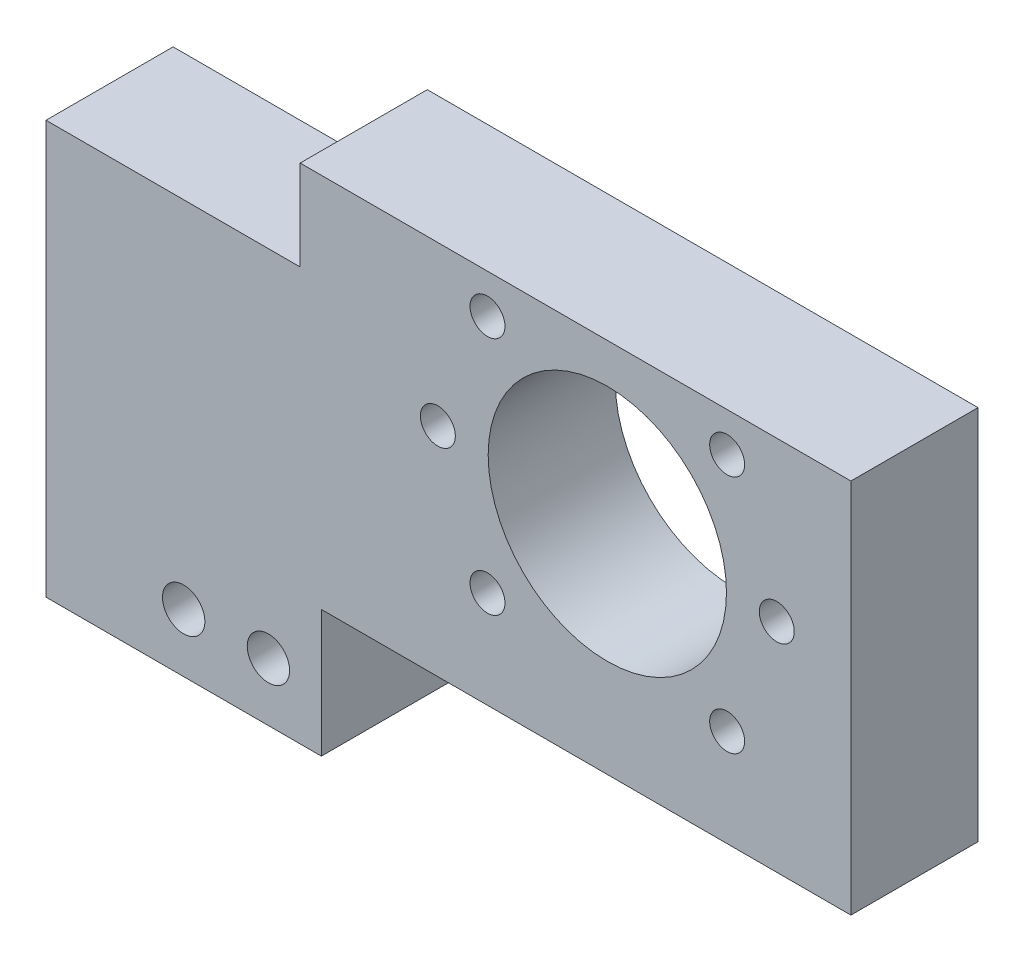
ISO-10303-21;
HEADER;
FILE_DESCRIPTION(('STEP AP214'),'2;1');
FILE_NAME('part.step','',(''),(''),'','','');
FILE_SCHEMA(('AUTOMOTIVE_DESIGN { 1 0 10303 214 1 1 1 1 }'));
ENDSEC;
DATA;
#1=APPLICATION_CONTEXT('core data for automotive mechanical design processes');
#2=APPLICATION_PROTOCOL_DEFINITION('international standard','automotive_design',2000,#1);
#3=PRODUCT_CONTEXT('',#1,'mechanical');
#4=PRODUCT('Part','Part','',(#3));
#5=PRODUCT_RELATED_PRODUCT_CATEGORY('part','',(#4));
#6=PRODUCT_DEFINITION_FORMATION('','',#4);
#7=PRODUCT_DEFINITION_CONTEXT('part definition',#1,'design');
#8=PRODUCT_DEFINITION('design','',#6,#7);
#9=PRODUCT_DEFINITION_SHAPE('','',#8);
#10=(LENGTH_UNIT() NAMED_UNIT(*) SI_UNIT(.MILLI.,.METRE.));
#11=(NAMED_UNIT(*) PLANE_ANGLE_UNIT() SI_UNIT($,.RADIAN.));
#12=(NAMED_UNIT(*) SI_UNIT($,.STERADIAN.) SOLID_ANGLE_UNIT());
#13=UNCERTAINTY_MEASURE_WITH_UNIT(LENGTH_MEASURE(1.E-05),#10,'distance_accuracy_value','');
#14=(GEOMETRIC_REPRESENTATION_CONTEXT(3) GLOBAL_UNCERTAINTY_ASSIGNED_CONTEXT((#13)) GLOBAL_UNIT_ASSIGNED_CONTEXT((#10,
#11,#12)) REPRESENTATION_CONTEXT('',''));
#15=CARTESIAN_POINT('',(0.,0.,0.));
#16=DIRECTION('',(0.,0.,1.));
#17=DIRECTION('',(1.,0.,0.));
#18=AXIS2_PLACEMENT_3D('',#15,#16,#17);
#19=CARTESIAN_POINT('',(-25.,-27.,27.));
#20=DIRECTION('',(0.,0.,-1.));
#21=DIRECTION('',(-1.,0.,0.));
#22=AXIS2_PLACEMENT_3D('',#19,#20,#21);
#23=CYLINDRICAL_SURFACE('',#22,2.);
#24=CARTESIAN_POINT('',(-25.,-27.,0.));
#25=DIRECTION('',(0.,0.,1.));
#26=DIRECTION('',(1.,0.,0.));
#27=AXIS2_PLACEMENT_3D('',#24,#25,#26);
#28=CIRCLE('',#27,2.);
#29=CARTESIAN_POINT('',(-23.,-27.,0.));
#30=VERTEX_POINT('',#29);
#31=EDGE_CURVE('E388',#30,#30,#28,.F.);
#32=ORIENTED_EDGE('',*,*,#31,.T.);
#33=EDGE_LOOP('',(#32));
#34=FACE_BOUND('',#33,.T.);
#35=CARTESIAN_POINT('',(-25.,-27.,12.));
#36=DIRECTION('',(0.,0.,-1.));
#37=DIRECTION('',(-1.,0.,0.));
#38=AXIS2_PLACEMENT_3D('',#35,#36,#37);
#39=CIRCLE('',#38,2.);
#40=CARTESIAN_POINT('',(-27.,-27.,12.));
#41=VERTEX_POINT('',#40);
#42=EDGE_CURVE('E223',#41,#41,#39,.T.);
#43=ORIENTED_EDGE('',*,*,#42,.F.);
#44=EDGE_LOOP('',(#43));
#45=FACE_BOUND('',#44,.T.);
#46=ADVANCED_FACE('F43',(#34,#45),#23,.F.);
#47=CARTESIAN_POINT('',(-17.,-27.,27.));
#48=DIRECTION('',(0.,0.,-1.));
#49=DIRECTION('',(-1.,0.,0.));
#50=AXIS2_PLACEMENT_3D('',#47,#48,#49);
#51=CYLINDRICAL_SURFACE('',#50,2.);
#52=CARTESIAN_POINT('',(-17.,-27.,0.));
#53=DIRECTION('',(0.,0.,1.));
#54=DIRECTION('',(1.,0.,0.));
#55=AXIS2_PLACEMENT_3D('',#52,#53,#54);
#56=CIRCLE('',#55,2.);
#57=CARTESIAN_POINT('',(-15.,-27.,0.));
#58=VERTEX_POINT('',#57);
#59=EDGE_CURVE('E384',#58,#58,#56,.F.);
#60=ORIENTED_EDGE('',*,*,#59,.T.);
#61=EDGE_LOOP('',(#60));
#62=FACE_BOUND('',#61,.T.);
#63=CARTESIAN_POINT('',(-17.,-27.,12.));
#64=DIRECTION('',(0.,0.,-1.));
#65=DIRECTION('',(-1.,0.,0.));
#66=AXIS2_PLACEMENT_3D('',#63,#64,#65);
#67=CIRCLE('',#66,2.);
#68=CARTESIAN_POINT('',(-19.,-27.,12.));
#69=VERTEX_POINT('',#68);
#70=EDGE_CURVE('E227',#69,#69,#67,.T.);
#71=ORIENTED_EDGE('',*,*,#70,.F.);
#72=EDGE_LOOP('',(#71));
#73=FACE_BOUND('',#72,.T.);
#74=ADVANCED_FACE('F423',(#62,#73),#51,.F.);
#75=CARTESIAN_POINT('',(0.,-20.5,0.));
#76=DIRECTION('',(0.,1.,0.));
#77=DIRECTION('',(0.,0.,1.));
#78=AXIS2_PLACEMENT_3D('',#75,#76,#77);
#79=PLANE('',#78);
#80=DIRECTION('',(0.,0.,1.));
#81=VECTOR('',#80,1.);
#82=CARTESIAN_POINT('',(38.,-20.5,0.));
#83=LINE('',#82,#81);
#84=CARTESIAN_POINT('',(38.,-20.5,0.));
#85=VERTEX_POINT('',#84);
#86=CARTESIAN_POINT('',(38.,-20.5,12.));
#87=VERTEX_POINT('',#86);
#88=EDGE_CURVE('E165',#85,#87,#83,.T.);
#89=ORIENTED_EDGE('',*,*,#88,.T.);
#90=DIRECTION('',(-1.,0.,0.));
#91=VECTOR('',#90,1.);
#92=CARTESIAN_POINT('',(38.,-20.5,12.));
#93=LINE('',#92,#91);
#94=CARTESIAN_POINT('',(-12.,-20.5,12.));
#95=VERTEX_POINT('',#94);
#96=EDGE_CURVE('E144',#87,#95,#93,.T.);
#97=ORIENTED_EDGE('',*,*,#96,.T.);
#98=DIRECTION('',(0.,0.,1.));
#99=VECTOR('',#98,1.);
#100=CARTESIAN_POINT('',(-12.,-20.5,12.));
#101=LINE('',#100,#99);
#102=CARTESIAN_POINT('',(-12.,-20.5,0.));
#103=VERTEX_POINT('',#102);
#104=EDGE_CURVE('E232',#103,#95,#101,.T.);
#105=ORIENTED_EDGE('',*,*,#104,.F.);
#106=DIRECTION('',(1.,0.,0.));
#107=VECTOR('',#106,1.);
#108=CARTESIAN_POINT('',(0.,-20.5,0.));
#109=LINE('',#108,#107);
#110=EDGE_CURVE('E172',#103,#85,#109,.T.);
#111=ORIENTED_EDGE('',*,*,#110,.T.);
#112=EDGE_LOOP('',(#89,#97,#105,#111));
#113=FACE_BOUND('',#112,.T.);
#114=ADVANCED_FACE('F171',(#113),#79,.F.);
#115=CARTESIAN_POINT('',(15.,0.,27.));
#116=DIRECTION('',(0.,0.,-1.));
#117=DIRECTION('',(-1.,0.,0.));
#118=AXIS2_PLACEMENT_3D('',#115,#116,#117);
#119=CYLINDRICAL_SURFACE('',#118,11.25);
#120=CARTESIAN_POINT('',(15.,0.,12.));
#121=DIRECTION('',(0.,0.,-1.));
#122=DIRECTION('',(-1.,0.,0.));
#123=AXIS2_PLACEMENT_3D('',#120,#121,#122);
#124=CIRCLE('',#123,11.25);
#125=CARTESIAN_POINT('',(3.75,0.,12.));
#126=VERTEX_POINT('',#125);
#127=EDGE_CURVE('E318',#126,#126,#124,.F.);
#128=ORIENTED_EDGE('',*,*,#127,.T.);
#129=EDGE_LOOP('',(#128));
#130=FACE_BOUND('',#129,.T.);
#131=CARTESIAN_POINT('',(15.,0.,0.));
#132=DIRECTION('',(0.,0.,-1.));
#133=DIRECTION('',(-1.,0.,0.));
#134=AXIS2_PLACEMENT_3D('',#131,#132,#133);
#135=CIRCLE('',#134,11.25);
#136=CARTESIAN_POINT('',(3.75,0.,0.));
#137=VERTEX_POINT('',#136);
#138=EDGE_CURVE('E219',#137,#137,#135,.F.);
#139=ORIENTED_EDGE('',*,*,#138,.F.);
#140=EDGE_LOOP('',(#139));
#141=FACE_BOUND('',#140,.T.);
#142=ADVANCED_FACE('F486',(#130,#141),#119,.F.);
#143=CARTESIAN_POINT('',(-35.,6.5,0.));
#144=DIRECTION('',(0.,-1.,0.));
#145=DIRECTION('',(0.,0.,-1.));
#146=AXIS2_PLACEMENT_3D('',#143,#144,#145);
#147=PLANE('',#146);
#148=DIRECTION('',(0.,0.,-1.));
#149=VECTOR('',#148,1.);
#150=CARTESIAN_POINT('',(-38.,6.5,27.));
#151=LINE('',#150,#149);
#152=CARTESIAN_POINT('',(-38.,6.5,12.));
#153=VERTEX_POINT('',#152);
#154=CARTESIAN_POINT('',(-38.,6.5,0.));
#155=VERTEX_POINT('',#154);
#156=EDGE_CURVE('E178',#153,#155,#151,.T.);
#157=ORIENTED_EDGE('',*,*,#156,.F.);
#158=DIRECTION('',(1.,0.,0.));
#159=VECTOR('',#158,1.);
#160=CARTESIAN_POINT('',(-35.,6.5,12.));
#161=LINE('',#160,#159);
#162=CARTESIAN_POINT('',(-14.,6.5,12.));
#163=VERTEX_POINT('',#162);
#164=EDGE_CURVE('E326',#153,#163,#161,.T.);
#165=ORIENTED_EDGE('',*,*,#164,.T.);
#166=DIRECTION('',(0.,0.,1.));
#167=VECTOR('',#166,1.);
#168=CARTESIAN_POINT('',(-14.,6.5,0.));
#169=LINE('',#168,#167);
#170=CARTESIAN_POINT('',(-14.,6.5,0.));
#171=VERTEX_POINT('',#170);
#172=EDGE_CURVE('E186',#171,#163,#169,.T.);
#173=ORIENTED_EDGE('',*,*,#172,.F.);
#174=DIRECTION('',(-1.,0.,0.));
#175=VECTOR('',#174,1.);
#176=CARTESIAN_POINT('',(-35.,6.5,0.));
#177=LINE('',#176,#175);
#178=EDGE_CURVE('E380',#171,#155,#177,.T.);
#179=ORIENTED_EDGE('',*,*,#178,.T.);
#180=EDGE_LOOP('',(#157,#165,#173,#179));
#181=FACE_BOUND('',#180,.T.);
#182=ADVANCED_FACE('F459',(#181),#147,.F.);
#183=CARTESIAN_POINT('',(-35.,15.,27.));
#184=DIRECTION('',(0.,-1.,0.));
#185=DIRECTION('',(0.,0.,-1.));
#186=AXIS2_PLACEMENT_3D('',#183,#184,#185);
#187=PLANE('',#186);
#188=DIRECTION('',(0.,0.,1.));
#189=VECTOR('',#188,1.);
#190=CARTESIAN_POINT('',(-14.,15.,0.));
#191=LINE('',#190,#189);
#192=CARTESIAN_POINT('',(-14.,15.,0.));
#193=VERTEX_POINT('',#192);
#194=CARTESIAN_POINT('',(-14.,15.,12.));
#195=VERTEX_POINT('',#194);
#196=EDGE_CURVE('E187',#193,#195,#191,.T.);
#197=ORIENTED_EDGE('',*,*,#196,.T.);
#198=DIRECTION('',(-1.,0.,0.));
#199=VECTOR('',#198,1.);
#200=CARTESIAN_POINT('',(38.,15.,12.));
#201=LINE('',#200,#199);
#202=CARTESIAN_POINT('',(38.,15.,12.));
#203=VERTEX_POINT('',#202);
#204=EDGE_CURVE('E158',#203,#195,#201,.T.);
#205=ORIENTED_EDGE('',*,*,#204,.F.);
#206=DIRECTION('',(0.,0.,1.));
#207=VECTOR('',#206,1.);
#208=CARTESIAN_POINT('',(38.,15.,0.));
#209=LINE('',#208,#207);
#210=CARTESIAN_POINT('',(38.,15.,0.));
#211=VERTEX_POINT('',#210);
#212=EDGE_CURVE('E167',#211,#203,#209,.T.);
#213=ORIENTED_EDGE('',*,*,#212,.F.);
#214=DIRECTION('',(1.,0.,0.));
#215=VECTOR('',#214,1.);
#216=CARTESIAN_POINT('',(-35.,15.,0.));
#217=LINE('',#216,#215);
#218=EDGE_CURVE('E218',#193,#211,#217,.T.);
#219=ORIENTED_EDGE('',*,*,#218,.F.);
#220=EDGE_LOOP('',(#197,#205,#213,#219));
#221=FACE_BOUND('',#220,.T.);
#222=ADVANCED_FACE('F320',(#221),#187,.F.);
#223=CARTESIAN_POINT('',(26.3137084989847,11.3137084989848,0.));
#224=DIRECTION('',(0.,0.,1.));
#225=DIRECTION('',(1.,0.,0.));
#226=AXIS2_PLACEMENT_3D('',#223,#224,#225);
#227=CYLINDRICAL_SURFACE('',#226,1.65);
#228=CARTESIAN_POINT('',(26.3137084989847,11.3137084989848,12.));
#229=DIRECTION('',(0.,0.,-1.));
#230=DIRECTION('',(-1.,0.,0.));
#231=AXIS2_PLACEMENT_3D('',#228,#229,#230);
#232=CIRCLE('',#231,1.65);
#233=CARTESIAN_POINT('',(24.6637084989847,11.3137084989848,12.));
#234=VERTEX_POINT('',#233);
#235=EDGE_CURVE('E352',#234,#234,#232,.F.);
#236=ORIENTED_EDGE('',*,*,#235,.T.);
#237=EDGE_LOOP('',(#236));
#238=FACE_BOUND('',#237,.T.);
#239=CARTESIAN_POINT('',(26.3137084989847,11.3137084989848,0.));
#240=DIRECTION('',(0.,0.,1.));
#241=DIRECTION('',(1.,0.,0.));
#242=AXIS2_PLACEMENT_3D('',#239,#240,#241);
#243=CIRCLE('',#242,1.65);
#244=CARTESIAN_POINT('',(27.9637084989847,11.3137084989848,0.));
#245=VERTEX_POINT('',#244);
#246=EDGE_CURVE('E204',#245,#245,#243,.T.);
#247=ORIENTED_EDGE('',*,*,#246,.F.);
#248=EDGE_LOOP('',(#247));
#249=FACE_BOUND('',#248,.T.);
#250=ADVANCED_FACE('F458',(#238,#249),#227,.F.);
#251=CARTESIAN_POINT('',(31.,0.,0.));
#252=DIRECTION('',(0.,0.,1.));
#253=DIRECTION('',(1.,0.,0.));
#254=AXIS2_PLACEMENT_3D('',#251,#252,#253);
#255=CYLINDRICAL_SURFACE('',#254,1.65);
#256=CARTESIAN_POINT('',(31.,0.,12.));
#257=DIRECTION('',(0.,0.,-1.));
#258=DIRECTION('',(-1.,0.,0.));
#259=AXIS2_PLACEMENT_3D('',#256,#257,#258);
#260=CIRCLE('',#259,1.65);
#261=CARTESIAN_POINT('',(29.35,0.,12.));
#262=VERTEX_POINT('',#261);
#263=EDGE_CURVE('E348',#262,#262,#260,.F.);
#264=ORIENTED_EDGE('',*,*,#263,.T.);
#265=EDGE_LOOP('',(#264));
#266=FACE_BOUND('',#265,.T.);
#267=CARTESIAN_POINT('',(31.,0.,0.));
#268=DIRECTION('',(0.,0.,1.));
#269=DIRECTION('',(1.,0.,0.));
#270=AXIS2_PLACEMENT_3D('',#267,#268,#269);
#271=CIRCLE('',#270,1.65);
#272=CARTESIAN_POINT('',(32.65,0.,0.));
#273=VERTEX_POINT('',#272);
#274=EDGE_CURVE('E200',#273,#273,#271,.T.);
#275=ORIENTED_EDGE('',*,*,#274,.F.);
#276=EDGE_LOOP('',(#275));
#277=FACE_BOUND('',#276,.T.);
#278=ADVANCED_FACE('F462',(#266,#277),#255,.F.);
#279=CARTESIAN_POINT('',(3.68629150101527,-11.3137084989848,0.));
#280=DIRECTION('',(0.,0.,1.));
#281=DIRECTION('',(1.,0.,0.));
#282=AXIS2_PLACEMENT_3D('',#279,#280,#281);
#283=CYLINDRICAL_SURFACE('',#282,1.65);
#284=CARTESIAN_POINT('',(3.68629150101527,-11.3137084989848,12.));
#285=DIRECTION('',(0.,0.,-1.));
#286=DIRECTION('',(-1.,0.,0.));
#287=AXIS2_PLACEMENT_3D('',#284,#285,#286);
#288=CIRCLE('',#287,1.65);
#289=CARTESIAN_POINT('',(2.03629150101526,-11.3137084989848,12.));
#290=VERTEX_POINT('',#289);
#291=EDGE_CURVE('E344',#290,#290,#288,.F.);
#292=ORIENTED_EDGE('',*,*,#291,.T.);
#293=EDGE_LOOP('',(#292));
#294=FACE_BOUND('',#293,.T.);
#295=CARTESIAN_POINT('',(3.68629150101527,-11.3137084989848,0.));
#296=DIRECTION('',(0.,0.,1.));
#297=DIRECTION('',(1.,0.,0.));
#298=AXIS2_PLACEMENT_3D('',#295,#296,#297);
#299=CIRCLE('',#298,1.65);
#300=CARTESIAN_POINT('',(5.33629150101527,-11.3137084989848,0.));
#301=VERTEX_POINT('',#300);
#302=EDGE_CURVE('E195',#301,#301,#299,.T.);
#303=ORIENTED_EDGE('',*,*,#302,.F.);
#304=EDGE_LOOP('',(#303));
#305=FACE_BOUND('',#304,.T.);
#306=ADVANCED_FACE('F473',(#294,#305),#283,.F.);
#307=CARTESIAN_POINT('',(3.68629150101526,11.3137084989848,0.));
#308=DIRECTION('',(0.,0.,1.));
#309=DIRECTION('',(1.,0.,0.));
#310=AXIS2_PLACEMENT_3D('',#307,#308,#309);
#311=CYLINDRICAL_SURFACE('',#310,1.65);
#312=CARTESIAN_POINT('',(3.68629150101526,11.3137084989848,12.));
#313=DIRECTION('',(0.,0.,-1.));
#314=DIRECTION('',(-1.,0.,0.));
#315=AXIS2_PLACEMENT_3D('',#312,#313,#314);
#316=CIRCLE('',#315,1.65);
#317=CARTESIAN_POINT('',(2.03629150101526,11.3137084989848,12.));
#318=VERTEX_POINT('',#317);
#319=EDGE_CURVE('E340',#318,#318,#316,.F.);
#320=ORIENTED_EDGE('',*,*,#319,.T.);
#321=EDGE_LOOP('',(#320));
#322=FACE_BOUND('',#321,.T.);
#323=CARTESIAN_POINT('',(3.68629150101526,11.3137084989848,0.));
#324=DIRECTION('',(0.,0.,1.));
#325=DIRECTION('',(-1.,0.,0.));
#326=AXIS2_PLACEMENT_3D('',#323,#324,#325);
#327=CIRCLE('',#326,1.65);
#328=CARTESIAN_POINT('',(2.03629150101526,11.3137084989848,0.));
#329=VERTEX_POINT('',#328);
#330=EDGE_CURVE('E199',#329,#329,#327,.T.);
#331=ORIENTED_EDGE('',*,*,#330,.F.);
#332=EDGE_LOOP('',(#331));
#333=FACE_BOUND('',#332,.T.);
#334=ADVANCED_FACE('F470',(#322,#333),#311,.F.);
#335=CARTESIAN_POINT('',(26.3137084989847,-11.3137084989848,0.));
#336=DIRECTION('',(0.,0.,1.));
#337=DIRECTION('',(1.,0.,0.));
#338=AXIS2_PLACEMENT_3D('',#335,#336,#337);
#339=CYLINDRICAL_SURFACE('',#338,1.65);
#340=CARTESIAN_POINT('',(26.3137084989847,-11.3137084989848,12.));
#341=DIRECTION('',(0.,0.,-1.));
#342=DIRECTION('',(-1.,0.,0.));
#343=AXIS2_PLACEMENT_3D('',#340,#341,#342);
#344=CIRCLE('',#343,1.65);
#345=CARTESIAN_POINT('',(24.6637084989847,-11.3137084989848,12.));
#346=VERTEX_POINT('',#345);
#347=EDGE_CURVE('E336',#346,#346,#344,.F.);
#348=ORIENTED_EDGE('',*,*,#347,.T.);
#349=EDGE_LOOP('',(#348));
#350=FACE_BOUND('',#349,.T.);
#351=CARTESIAN_POINT('',(26.3137084989847,-11.3137084989848,0.));
#352=DIRECTION('',(0.,0.,1.));
#353=DIRECTION('',(-1.,0.,0.));
#354=AXIS2_PLACEMENT_3D('',#351,#352,#353);
#355=CIRCLE('',#354,1.65);
#356=CARTESIAN_POINT('',(24.6637084989847,-11.3137084989848,0.));
#357=VERTEX_POINT('',#356);
#358=EDGE_CURVE('E205',#357,#357,#355,.T.);
#359=ORIENTED_EDGE('',*,*,#358,.F.);
#360=EDGE_LOOP('',(#359));
#361=FACE_BOUND('',#360,.T.);
#362=ADVANCED_FACE('F468',(#350,#361),#339,.F.);
#363=CARTESIAN_POINT('',(-0.999999999999997,0.,0.));
#364=DIRECTION('',(0.,0.,1.));
#365=DIRECTION('',(1.,0.,0.));
#366=AXIS2_PLACEMENT_3D('',#363,#364,#365);
#367=CYLINDRICAL_SURFACE('',#366,1.65);
#368=CARTESIAN_POINT('',(-0.999999999999997,0.,12.));
#369=DIRECTION('',(0.,0.,-1.));
#370=DIRECTION('',(-1.,0.,0.));
#371=AXIS2_PLACEMENT_3D('',#368,#369,#370);
#372=CIRCLE('',#371,1.65);
#373=CARTESIAN_POINT('',(-2.65,0.,12.));
#374=VERTEX_POINT('',#373);
#375=EDGE_CURVE('E332',#374,#374,#372,.F.);
#376=ORIENTED_EDGE('',*,*,#375,.T.);
#377=EDGE_LOOP('',(#376));
#378=FACE_BOUND('',#377,.T.);
#379=CARTESIAN_POINT('',(-0.999999999999997,0.,0.));
#380=DIRECTION('',(0.,0.,1.));
#381=DIRECTION('',(1.,0.,0.));
#382=AXIS2_PLACEMENT_3D('',#379,#380,#381);
#383=CIRCLE('',#382,1.65);
#384=CARTESIAN_POINT('',(0.650000000000003,0.,0.));
#385=VERTEX_POINT('',#384);
#386=EDGE_CURVE('E180',#385,#385,#383,.T.);
#387=ORIENTED_EDGE('',*,*,#386,.F.);
#388=EDGE_LOOP('',(#387));
#389=FACE_BOUND('',#388,.T.);
#390=ADVANCED_FACE('F464',(#378,#389),#367,.F.);
#391=CARTESIAN_POINT('',(-14.,15.,0.));
#392=DIRECTION('',(1.,0.,0.));
#393=DIRECTION('',(0.,0.,-1.));
#394=AXIS2_PLACEMENT_3D('',#391,#392,#393);
#395=PLANE('',#394);
#396=ORIENTED_EDGE('',*,*,#172,.T.);
#397=DIRECTION('',(0.,1.,0.));
#398=VECTOR('',#397,1.);
#399=CARTESIAN_POINT('',(-14.,15.,12.));
#400=LINE('',#399,#398);
#401=EDGE_CURVE('E323',#163,#195,#400,.T.);
#402=ORIENTED_EDGE('',*,*,#401,.T.);
#403=ORIENTED_EDGE('',*,*,#196,.F.);
#404=DIRECTION('',(0.,-1.,0.));
#405=VECTOR('',#404,1.);
#406=CARTESIAN_POINT('',(-14.,15.,0.));
#407=LINE('',#406,#405);
#408=EDGE_CURVE('E313',#193,#171,#407,.T.);
#409=ORIENTED_EDGE('',*,*,#408,.T.);
#410=EDGE_LOOP('',(#396,#402,#403,#409));
#411=FACE_BOUND('',#410,.T.);
#412=ADVANCED_FACE('F467',(#411),#395,.F.);
#413=CARTESIAN_POINT('',(-38.,0.,0.));
#414=DIRECTION('',(-1.,0.,0.));
#415=DIRECTION('',(0.,0.,1.));
#416=AXIS2_PLACEMENT_3D('',#413,#414,#415);
#417=PLANE('',#416);
#418=DIRECTION('',(0.,-1.,0.));
#419=VECTOR('',#418,1.);
#420=CARTESIAN_POINT('',(-38.,-12.5,12.));
#421=LINE('',#420,#419);
#422=CARTESIAN_POINT('',(-38.,-32.5,12.));
#423=VERTEX_POINT('',#422);
#424=EDGE_CURVE('E174',#153,#423,#421,.T.);
#425=ORIENTED_EDGE('',*,*,#424,.F.);
#426=ORIENTED_EDGE('',*,*,#156,.T.);
#427=DIRECTION('',(0.,-1.,0.));
#428=VECTOR('',#427,1.);
#429=CARTESIAN_POINT('',(-38.,-32.5,0.));
#430=LINE('',#429,#428);
#431=CARTESIAN_POINT('',(-38.,-32.5,0.));
#432=VERTEX_POINT('',#431);
#433=EDGE_CURVE('E317',#155,#432,#430,.T.);
#434=ORIENTED_EDGE('',*,*,#433,.T.);
#435=DIRECTION('',(0.,0.,-1.));
#436=VECTOR('',#435,1.);
#437=CARTESIAN_POINT('',(-38.,-32.5,12.));
#438=LINE('',#437,#436);
#439=EDGE_CURVE('E392',#423,#432,#438,.T.);
#440=ORIENTED_EDGE('',*,*,#439,.F.);
#441=EDGE_LOOP('',(#425,#426,#434,#440));
#442=FACE_BOUND('',#441,.T.);
#443=ADVANCED_FACE('F490',(#442),#417,.T.);
#444=CARTESIAN_POINT('',(38.,0.,0.));
#445=DIRECTION('',(1.,0.,0.));
#446=DIRECTION('',(0.,0.,-1.));
#447=AXIS2_PLACEMENT_3D('',#444,#445,#446);
#448=PLANE('',#447);
#449=DIRECTION('',(0.,-1.,0.));
#450=VECTOR('',#449,1.);
#451=CARTESIAN_POINT('',(38.,-20.5,12.));
#452=LINE('',#451,#450);
#453=EDGE_CURVE('E148',#203,#87,#452,.T.);
#454=ORIENTED_EDGE('',*,*,#453,.T.);
#455=ORIENTED_EDGE('',*,*,#88,.F.);
#456=DIRECTION('',(0.,-1.,0.));
#457=VECTOR('',#456,1.);
#458=CARTESIAN_POINT('',(38.,-32.5,0.));
#459=LINE('',#458,#457);
#460=EDGE_CURVE('E311',#211,#85,#459,.T.);
#461=ORIENTED_EDGE('',*,*,#460,.F.);
#462=ORIENTED_EDGE('',*,*,#212,.T.);
#463=EDGE_LOOP('',(#454,#455,#461,#462));
#464=FACE_BOUND('',#463,.T.);
#465=ADVANCED_FACE('F163',(#464),#448,.T.);
#466=CARTESIAN_POINT('',(-38.,-12.5,12.));
#467=DIRECTION('',(0.,0.,-1.));
#468=DIRECTION('',(-1.,0.,0.));
#469=AXIS2_PLACEMENT_3D('',#466,#467,#468);
#470=PLANE('',#469);
#471=ORIENTED_EDGE('',*,*,#70,.T.);
#472=EDGE_LOOP('',(#471));
#473=FACE_BOUND('',#472,.T.);
#474=ORIENTED_EDGE('',*,*,#42,.T.);
#475=EDGE_LOOP('',(#474));
#476=FACE_BOUND('',#475,.T.);
#477=DIRECTION('',(0.,1.,0.));
#478=VECTOR('',#477,1.);
#479=CARTESIAN_POINT('',(-12.,-37.5,12.));
#480=LINE('',#479,#478);
#481=CARTESIAN_POINT('',(-12.,-32.5,12.));
#482=VERTEX_POINT('',#481);
#483=EDGE_CURVE('E152',#482,#95,#480,.T.);
#484=ORIENTED_EDGE('',*,*,#483,.T.);
#485=ORIENTED_EDGE('',*,*,#96,.F.);
#486=ORIENTED_EDGE('',*,*,#453,.F.);
#487=ORIENTED_EDGE('',*,*,#204,.T.);
#488=ORIENTED_EDGE('',*,*,#401,.F.);
#489=ORIENTED_EDGE('',*,*,#164,.F.);
#490=ORIENTED_EDGE('',*,*,#424,.T.);
#491=DIRECTION('',(-1.,0.,0.));
#492=VECTOR('',#491,1.);
#493=CARTESIAN_POINT('',(38.,-32.5,12.));
#494=LINE('',#493,#492);
#495=EDGE_CURVE('E395',#482,#423,#494,.T.);
#496=ORIENTED_EDGE('',*,*,#495,.F.);
#497=EDGE_LOOP('',(#484,#485,#486,#487,#488,#489,#490,#496));
#498=FACE_BOUND('',#497,.T.);
#499=ORIENTED_EDGE('',*,*,#235,.F.);
#500=EDGE_LOOP('',(#499));
#501=FACE_BOUND('',#500,.T.);
#502=ORIENTED_EDGE('',*,*,#291,.F.);
#503=EDGE_LOOP('',(#502));
#504=FACE_BOUND('',#503,.T.);
#505=ORIENTED_EDGE('',*,*,#347,.F.);
#506=EDGE_LOOP('',(#505));
#507=FACE_BOUND('',#506,.T.);
#508=ORIENTED_EDGE('',*,*,#375,.F.);
#509=EDGE_LOOP('',(#508));
#510=FACE_BOUND('',#509,.T.);
#511=ORIENTED_EDGE('',*,*,#319,.F.);
#512=EDGE_LOOP('',(#511));
#513=FACE_BOUND('',#512,.T.);
#514=ORIENTED_EDGE('',*,*,#263,.F.);
#515=EDGE_LOOP('',(#514));
#516=FACE_BOUND('',#515,.T.);
#517=ORIENTED_EDGE('',*,*,#127,.F.);
#518=EDGE_LOOP('',(#517));
#519=FACE_BOUND('',#518,.T.);
#520=ADVANCED_FACE('F146',(#473,#476,#498,#501,#504,#507,#510,#513,#516,#519),#470,.F.);
#521=CARTESIAN_POINT('',(15.,0.,0.));
#522=DIRECTION('',(0.,0.,-1.));
#523=DIRECTION('',(-1.,0.,0.));
#524=AXIS2_PLACEMENT_3D('',#521,#522,#523);
#525=PLANE('',#524);
#526=ORIENTED_EDGE('',*,*,#408,.F.);
#527=ORIENTED_EDGE('',*,*,#218,.T.);
#528=ORIENTED_EDGE('',*,*,#460,.T.);
#529=ORIENTED_EDGE('',*,*,#110,.F.);
#530=DIRECTION('',(0.,1.,0.));
#531=VECTOR('',#530,1.);
#532=CARTESIAN_POINT('',(-12.,-37.5,0.));
#533=LINE('',#532,#531);
#534=CARTESIAN_POINT('',(-12.,-32.5,0.));
#535=VERTEX_POINT('',#534);
#536=EDGE_CURVE('E59',#535,#103,#533,.T.);
#537=ORIENTED_EDGE('',*,*,#536,.F.);
#538=DIRECTION('',(1.,0.,0.));
#539=VECTOR('',#538,1.);
#540=CARTESIAN_POINT('',(38.,-32.5,0.));
#541=LINE('',#540,#539);
#542=CARTESIAN_POINT('',(-30.,-32.5,0.));
#543=VERTEX_POINT('',#542);
#544=EDGE_CURVE('E11',#543,#535,#541,.T.);
#545=ORIENTED_EDGE('',*,*,#544,.F.);
#546=DIRECTION('',(0.,-1.,0.));
#547=VECTOR('',#546,1.);
#548=CARTESIAN_POINT('',(-30.,-21.5,0.));
#549=LINE('',#548,#547);
#550=CARTESIAN_POINT('',(-30.,-21.5,0.));
#551=VERTEX_POINT('',#550);
#552=EDGE_CURVE('E365',#551,#543,#549,.T.);
#553=ORIENTED_EDGE('',*,*,#552,.F.);
#554=DIRECTION('',(-1.,0.,0.));
#555=VECTOR('',#554,1.);
#556=CARTESIAN_POINT('',(-31.,-21.5,0.));
#557=LINE('',#556,#555);
#558=CARTESIAN_POINT('',(-32.,-21.5,0.));
#559=VERTEX_POINT('',#558);
#560=EDGE_CURVE('E369',#551,#559,#557,.T.);
#561=ORIENTED_EDGE('',*,*,#560,.T.);
#562=DIRECTION('',(0.,1.,0.));
#563=VECTOR('',#562,1.);
#564=CARTESIAN_POINT('',(-32.,-21.5,0.));
#565=LINE('',#564,#563);
#566=CARTESIAN_POINT('',(-32.,-32.5,0.));
#567=VERTEX_POINT('',#566);
#568=EDGE_CURVE('E281',#567,#559,#565,.T.);
#569=ORIENTED_EDGE('',*,*,#568,.F.);
#570=DIRECTION('',(1.,0.,0.));
#571=VECTOR('',#570,1.);
#572=CARTESIAN_POINT('',(-38.,-32.5,0.));
#573=LINE('',#572,#571);
#574=EDGE_CURVE('E361',#432,#567,#573,.T.);
#575=ORIENTED_EDGE('',*,*,#574,.F.);
#576=ORIENTED_EDGE('',*,*,#433,.F.);
#577=ORIENTED_EDGE('',*,*,#178,.F.);
#578=EDGE_LOOP('',(#526,#527,#528,#529,#537,#545,#553,#561,#569,#575,#576,#577));
#579=FACE_BOUND('',#578,.T.);
#580=ORIENTED_EDGE('',*,*,#138,.T.);
#581=EDGE_LOOP('',(#580));
#582=FACE_BOUND('',#581,.T.);
#583=ORIENTED_EDGE('',*,*,#246,.T.);
#584=EDGE_LOOP('',(#583));
#585=FACE_BOUND('',#584,.T.);
#586=ORIENTED_EDGE('',*,*,#274,.T.);
#587=EDGE_LOOP('',(#586));
#588=FACE_BOUND('',#587,.T.);
#589=ORIENTED_EDGE('',*,*,#302,.T.);
#590=EDGE_LOOP('',(#589));
#591=FACE_BOUND('',#590,.T.);
#592=ORIENTED_EDGE('',*,*,#330,.T.);
#593=EDGE_LOOP('',(#592));
#594=FACE_BOUND('',#593,.T.);
#595=ORIENTED_EDGE('',*,*,#358,.T.);
#596=EDGE_LOOP('',(#595));
#597=FACE_BOUND('',#596,.T.);
#598=ORIENTED_EDGE('',*,*,#386,.T.);
#599=EDGE_LOOP('',(#598));
#600=FACE_BOUND('',#599,.T.);
#601=ORIENTED_EDGE('',*,*,#59,.F.);
#602=EDGE_LOOP('',(#601));
#603=FACE_BOUND('',#602,.T.);
#604=ORIENTED_EDGE('',*,*,#31,.F.);
#605=EDGE_LOOP('',(#604));
#606=FACE_BOUND('',#605,.T.);
#607=ADVANCED_FACE('F309',(#579,#582,#585,#588,#591,#594,#597,#600,#603,#606),#525,.T.);
#608=CARTESIAN_POINT('',(-12.,-37.5,12.));
#609=DIRECTION('',(-1.,0.,0.));
#610=DIRECTION('',(0.,0.,1.));
#611=AXIS2_PLACEMENT_3D('',#608,#609,#610);
#612=PLANE('',#611);
#613=DIRECTION('',(0.,0.,-1.));
#614=VECTOR('',#613,1.);
#615=CARTESIAN_POINT('',(-12.,-32.5,12.));
#616=LINE('',#615,#614);
#617=EDGE_CURVE('E284',#482,#535,#616,.T.);
#618=ORIENTED_EDGE('',*,*,#617,.T.);
#619=ORIENTED_EDGE('',*,*,#536,.T.);
#620=ORIENTED_EDGE('',*,*,#104,.T.);
#621=ORIENTED_EDGE('',*,*,#483,.F.);
#622=EDGE_LOOP('',(#618,#619,#620,#621));
#623=FACE_BOUND('',#622,.T.);
#624=ADVANCED_FACE('F412',(#623),#612,.F.);
#625=CARTESIAN_POINT('',(-31.,-21.5,7.));
#626=DIRECTION('',(0.,-1.,0.));
#627=DIRECTION('',(0.,0.,-1.));
#628=AXIS2_PLACEMENT_3D('',#625,#626,#627);
#629=CYLINDRICAL_SURFACE('',#628,3.1);
#630=DIRECTION('',(0.,-1.,0.));
#631=VECTOR('',#630,1.);
#632=CARTESIAN_POINT('',(-29.1764705882353,-21.5,4.49306153158298));
#633=LINE('',#632,#631);
#634=CARTESIAN_POINT('',(-29.1764705882353,-21.5,4.49306153158298));
#635=VERTEX_POINT('',#634);
#636=CARTESIAN_POINT('',(-29.1764705882353,-32.5,4.49306153158298));
#637=VERTEX_POINT('',#636);
#638=EDGE_CURVE('E235',#635,#637,#633,.T.);
#639=ORIENTED_EDGE('',*,*,#638,.T.);
#640=CARTESIAN_POINT('',(-31.,-32.5,7.));
#641=DIRECTION('',(0.,1.,0.));
#642=DIRECTION('',(0.,0.,1.));
#643=AXIS2_PLACEMENT_3D('',#640,#641,#642);
#644=CIRCLE('',#643,3.1);
#645=CARTESIAN_POINT('',(-32.8235294117647,-32.5,4.49306153158299));
#646=VERTEX_POINT('',#645);
#647=EDGE_CURVE('E257',#637,#646,#644,.F.);
#648=ORIENTED_EDGE('',*,*,#647,.T.);
#649=DIRECTION('',(0.,-1.,0.));
#650=VECTOR('',#649,1.);
#651=CARTESIAN_POINT('',(-32.8235294117647,-21.5,4.49306153158299));
#652=LINE('',#651,#650);
#653=CARTESIAN_POINT('',(-32.8235294117647,-21.5,4.49306153158299));
#654=VERTEX_POINT('',#653);
#655=EDGE_CURVE('E191',#646,#654,#652,.F.);
#656=ORIENTED_EDGE('',*,*,#655,.T.);
#657=CARTESIAN_POINT('',(-31.,-21.5,7.));
#658=DIRECTION('',(0.,-1.,0.));
#659=DIRECTION('',(0.,0.,-1.));
#660=AXIS2_PLACEMENT_3D('',#657,#658,#659);
#661=CIRCLE('',#660,3.1);
#662=EDGE_CURVE('E228',#635,#654,#661,.T.);
#663=ORIENTED_EDGE('',*,*,#662,.F.);
#664=EDGE_LOOP('',(#639,#648,#656,#663));
#665=FACE_BOUND('',#664,.T.);
#666=ADVANCED_FACE('F263',(#665),#629,.F.);
#667=CARTESIAN_POINT('',(-31.,-21.5,7.));
#668=DIRECTION('',(0.,-1.,0.));
#669=DIRECTION('',(0.,0.,-1.));
#670=AXIS2_PLACEMENT_3D('',#667,#668,#669);
#671=PLANE('',#670);
#672=ORIENTED_EDGE('',*,*,#560,.F.);
#673=DIRECTION('',(0.,0.,1.));
#674=VECTOR('',#673,1.);
#675=CARTESIAN_POINT('',(-30.,-21.5,4.06571984977576));
#676=LINE('',#675,#674);
#677=CARTESIAN_POINT('',(-30.,-21.5,2.87568187453975));
#678=VERTEX_POINT('',#677);
#679=EDGE_CURVE('E283',#551,#678,#676,.T.);
#680=ORIENTED_EDGE('',*,*,#679,.T.);
#681=CARTESIAN_POINT('',(-28.,-21.5,2.87568187453975));
#682=DIRECTION('',(0.,-1.,0.));
#683=DIRECTION('',(0.,0.,-1.));
#684=AXIS2_PLACEMENT_3D('',#681,#682,#683);
#685=CIRCLE('',#684,2.);
#686=EDGE_CURVE('E247',#678,#635,#685,.F.);
#687=ORIENTED_EDGE('',*,*,#686,.T.);
#688=ORIENTED_EDGE('',*,*,#662,.T.);
#689=CARTESIAN_POINT('',(-34.,-21.5,2.87568187453975));
#690=DIRECTION('',(0.,-1.,0.));
#691=DIRECTION('',(0.,0.,-1.));
#692=AXIS2_PLACEMENT_3D('',#689,#690,#691);
#693=CIRCLE('',#692,2.);
#694=CARTESIAN_POINT('',(-32.,-21.5,2.87568187453975));
#695=VERTEX_POINT('',#694);
#696=EDGE_CURVE('E250',#654,#695,#693,.F.);
#697=ORIENTED_EDGE('',*,*,#696,.T.);
#698=DIRECTION('',(0.,0.,-1.));
#699=VECTOR('',#698,1.);
#700=CARTESIAN_POINT('',(-32.,-21.5,4.06571984977576));
#701=LINE('',#700,#699);
#702=EDGE_CURVE('E277',#695,#559,#701,.T.);
#703=ORIENTED_EDGE('',*,*,#702,.T.);
#704=EDGE_LOOP('',(#672,#680,#687,#688,#697,#703));
#705=FACE_BOUND('',#704,.T.);
#706=CARTESIAN_POINT('',(-31.,-21.5,7.));
#707=DIRECTION('',(0.,-1.,0.));
#708=DIRECTION('',(0.,0.,-1.));
#709=AXIS2_PLACEMENT_3D('',#706,#707,#708);
#710=CIRCLE('',#709,1.25);
#711=CARTESIAN_POINT('',(-31.,-21.5,5.75));
#712=VERTEX_POINT('',#711);
#713=EDGE_CURVE('E288',#712,#712,#710,.T.);
#714=ORIENTED_EDGE('',*,*,#713,.F.);
#715=EDGE_LOOP('',(#714));
#716=FACE_BOUND('',#715,.T.);
#717=ADVANCED_FACE('F275',(#705,#716),#671,.T.);
#718=CARTESIAN_POINT('',(-31.,-11.5,7.));
#719=DIRECTION('',(0.,-1.,0.));
#720=DIRECTION('',(0.,0.,-1.));
#721=AXIS2_PLACEMENT_3D('',#718,#719,#720);
#722=CYLINDRICAL_SURFACE('',#721,1.25);
#723=CARTESIAN_POINT('',(-31.,-11.5,7.));
#724=DIRECTION('',(0.,-1.,0.));
#725=DIRECTION('',(0.,0.,-1.));
#726=AXIS2_PLACEMENT_3D('',#723,#724,#725);
#727=CIRCLE('',#726,1.25);
#728=CARTESIAN_POINT('',(-31.,-11.5,5.75));
#729=VERTEX_POINT('',#728);
#730=EDGE_CURVE('E295',#729,#729,#727,.T.);
#731=ORIENTED_EDGE('',*,*,#730,.F.);
#732=EDGE_LOOP('',(#731));
#733=FACE_BOUND('',#732,.T.);
#734=ORIENTED_EDGE('',*,*,#713,.T.);
#735=EDGE_LOOP('',(#734));
#736=FACE_BOUND('',#735,.T.);
#737=ADVANCED_FACE('F434',(#733,#736),#722,.F.);
#738=CARTESIAN_POINT('',(-31.,-11.5,7.));
#739=DIRECTION('',(0.,-1.,0.));
#740=DIRECTION('',(0.,0.,-1.));
#741=AXIS2_PLACEMENT_3D('',#738,#739,#740);
#742=PLANE('',#741);
#743=ORIENTED_EDGE('',*,*,#730,.T.);
#744=EDGE_LOOP('',(#743));
#745=FACE_BOUND('',#744,.T.);
#746=ADVANCED_FACE('F437',(#745),#742,.T.);
#747=CARTESIAN_POINT('',(-32.,-21.5,4.06571984977576));
#748=DIRECTION('',(-1.,0.,0.));
#749=DIRECTION('',(0.,0.,1.));
#750=AXIS2_PLACEMENT_3D('',#747,#748,#749);
#751=PLANE('',#750);
#752=DIRECTION('',(0.,0.,-1.));
#753=VECTOR('',#752,1.);
#754=CARTESIAN_POINT('',(-32.,-32.5,4.06571984977576));
#755=LINE('',#754,#753);
#756=CARTESIAN_POINT('',(-32.,-32.5,2.87568187453975));
#757=VERTEX_POINT('',#756);
#758=EDGE_CURVE('E66',#757,#567,#755,.T.);
#759=ORIENTED_EDGE('',*,*,#758,.T.);
#760=ORIENTED_EDGE('',*,*,#568,.T.);
#761=ORIENTED_EDGE('',*,*,#702,.F.);
#762=DIRECTION('',(0.,-1.,0.));
#763=VECTOR('',#762,1.);
#764=CARTESIAN_POINT('',(-32.,-21.5,2.87568187453975));
#765=LINE('',#764,#763);
#766=EDGE_CURVE('E243',#695,#757,#765,.T.);
#767=ORIENTED_EDGE('',*,*,#766,.T.);
#768=EDGE_LOOP('',(#759,#760,#761,#767));
#769=FACE_BOUND('',#768,.T.);
#770=ADVANCED_FACE('F280',(#769),#751,.F.);
#771=CARTESIAN_POINT('',(-30.,-21.5,4.06571984977576));
#772=DIRECTION('',(1.,0.,0.));
#773=DIRECTION('',(0.,0.,-1.));
#774=AXIS2_PLACEMENT_3D('',#771,#772,#773);
#775=PLANE('',#774);
#776=ORIENTED_EDGE('',*,*,#679,.F.);
#777=ORIENTED_EDGE('',*,*,#552,.T.);
#778=DIRECTION('',(0.,0.,1.));
#779=VECTOR('',#778,1.);
#780=CARTESIAN_POINT('',(-30.,-32.5,4.06571984977576));
#781=LINE('',#780,#779);
#782=CARTESIAN_POINT('',(-30.,-32.5,2.87568187453975));
#783=VERTEX_POINT('',#782);
#784=EDGE_CURVE('E291',#543,#783,#781,.T.);
#785=ORIENTED_EDGE('',*,*,#784,.T.);
#786=DIRECTION('',(0.,-1.,0.));
#787=VECTOR('',#786,1.);
#788=CARTESIAN_POINT('',(-30.,-21.5,2.87568187453975));
#789=LINE('',#788,#787);
#790=EDGE_CURVE('E239',#783,#678,#789,.F.);
#791=ORIENTED_EDGE('',*,*,#790,.T.);
#792=EDGE_LOOP('',(#776,#777,#785,#791));
#793=FACE_BOUND('',#792,.T.);
#794=ADVANCED_FACE('F406',(#793),#775,.F.);
#795=CARTESIAN_POINT('',(-28.,-21.5,2.87568187453975));
#796=DIRECTION('',(0.,-1.,0.));
#797=DIRECTION('',(0.,0.,-1.));
#798=AXIS2_PLACEMENT_3D('',#795,#796,#797);
#799=CYLINDRICAL_SURFACE('',#798,2.);
#800=CARTESIAN_POINT('',(-28.,-32.5,2.87568187453975));
#801=DIRECTION('',(0.,1.,0.));
#802=DIRECTION('',(0.,0.,1.));
#803=AXIS2_PLACEMENT_3D('',#800,#801,#802);
#804=CIRCLE('',#803,2.);
#805=EDGE_CURVE('E268',#637,#783,#804,.F.);
#806=ORIENTED_EDGE('',*,*,#805,.F.);
#807=ORIENTED_EDGE('',*,*,#638,.F.);
#808=ORIENTED_EDGE('',*,*,#686,.F.);
#809=ORIENTED_EDGE('',*,*,#790,.F.);
#810=EDGE_LOOP('',(#806,#807,#808,#809));
#811=FACE_BOUND('',#810,.T.);
#812=ADVANCED_FACE('F410',(#811),#799,.T.);
#813=CARTESIAN_POINT('',(-34.,-21.5,2.87568187453975));
#814=DIRECTION('',(0.,-1.,0.));
#815=DIRECTION('',(0.,0.,-1.));
#816=AXIS2_PLACEMENT_3D('',#813,#814,#815);
#817=CYLINDRICAL_SURFACE('',#816,2.);
#818=CARTESIAN_POINT('',(-34.,-32.5,2.87568187453975));
#819=DIRECTION('',(0.,1.,0.));
#820=DIRECTION('',(0.,0.,1.));
#821=AXIS2_PLACEMENT_3D('',#818,#819,#820);
#822=CIRCLE('',#821,2.);
#823=EDGE_CURVE('E52',#757,#646,#822,.F.);
#824=ORIENTED_EDGE('',*,*,#823,.F.);
#825=ORIENTED_EDGE('',*,*,#766,.F.);
#826=ORIENTED_EDGE('',*,*,#696,.F.);
#827=ORIENTED_EDGE('',*,*,#655,.F.);
#828=EDGE_LOOP('',(#824,#825,#826,#827));
#829=FACE_BOUND('',#828,.T.);
#830=ADVANCED_FACE('F45',(#829),#817,.T.);
#831=CARTESIAN_POINT('',(38.,-32.5,12.));
#832=DIRECTION('',(0.,1.,0.));
#833=DIRECTION('',(0.,0.,1.));
#834=AXIS2_PLACEMENT_3D('',#831,#832,#833);
#835=PLANE('',#834);
#836=ORIENTED_EDGE('',*,*,#439,.T.);
#837=ORIENTED_EDGE('',*,*,#574,.T.);
#838=ORIENTED_EDGE('',*,*,#758,.F.);
#839=ORIENTED_EDGE('',*,*,#823,.T.);
#840=ORIENTED_EDGE('',*,*,#647,.F.);
#841=ORIENTED_EDGE('',*,*,#805,.T.);
#842=ORIENTED_EDGE('',*,*,#784,.F.);
#843=ORIENTED_EDGE('',*,*,#544,.T.);
#844=ORIENTED_EDGE('',*,*,#617,.F.);
#845=ORIENTED_EDGE('',*,*,#495,.T.);
#846=EDGE_LOOP('',(#836,#837,#838,#839,#840,#841,#842,#843,#844,#845));
#847=FACE_BOUND('',#846,.T.);
#848=ADVANCED_FACE('F255',(#847),#835,.F.);
#849=CLOSED_SHELL('',(#46,#74,#114,#142,#182,#222,#250,#278,#306,#334,#362,#390,#412,#443,#465,
#520,#607,#624,#666,#717,#737,#746,#770,#794,#812,#830,#848));
#850=MANIFOLD_SOLID_BREP('B2',#849);
#851=ADVANCED_BREP_SHAPE_REPRESENTATION('',(#18,#850),#14);
#852=SHAPE_DEFINITION_REPRESENTATION(#9,#851);
ENDSEC;
END-ISO-10303-21;
